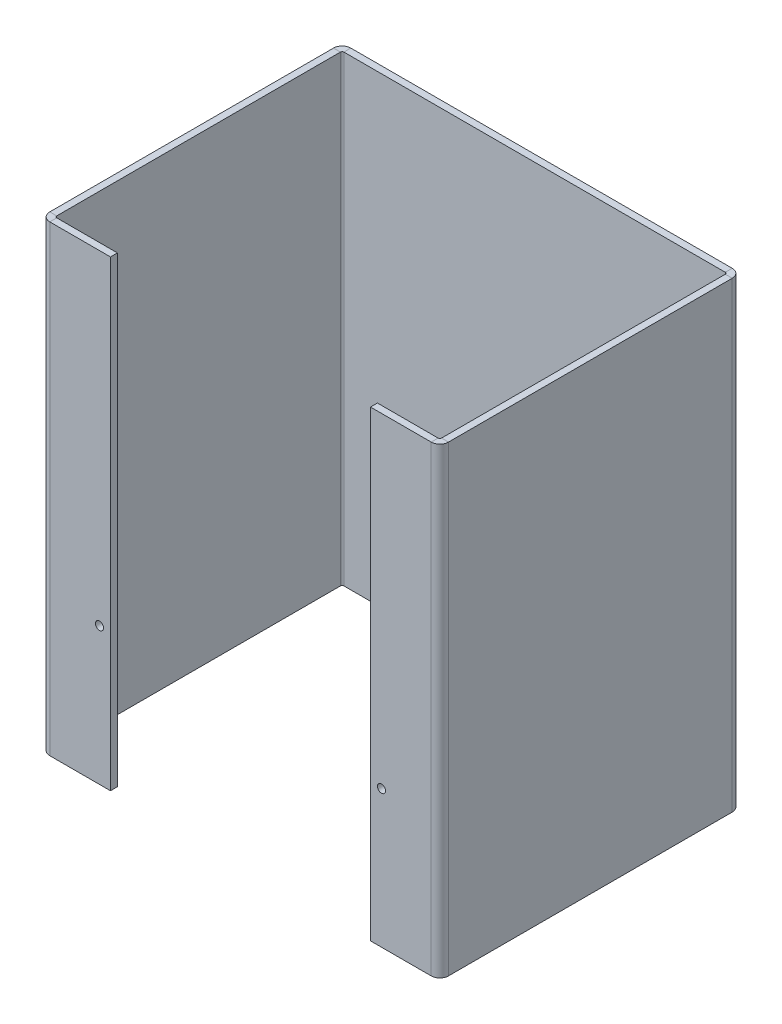
ISO-10303-21;
HEADER;
FILE_DESCRIPTION(('STEP AP214'),'2;1');
FILE_NAME('part.step','',(''),(''),'','','');
FILE_SCHEMA(('AUTOMOTIVE_DESIGN { 1 0 10303 214 1 1 1 1 }'));
ENDSEC;
DATA;
#1=APPLICATION_CONTEXT('core data for automotive mechanical design processes');
#2=APPLICATION_PROTOCOL_DEFINITION('international standard','automotive_design',2000,#1);
#3=PRODUCT_CONTEXT('',#1,'mechanical');
#4=PRODUCT('Part','Part','',(#3));
#5=PRODUCT_RELATED_PRODUCT_CATEGORY('part','',(#4));
#6=PRODUCT_DEFINITION_FORMATION('','',#4);
#7=PRODUCT_DEFINITION_CONTEXT('part definition',#1,'design');
#8=PRODUCT_DEFINITION('design','',#6,#7);
#9=PRODUCT_DEFINITION_SHAPE('','',#8);
#10=(LENGTH_UNIT() NAMED_UNIT(*) SI_UNIT(.MILLI.,.METRE.));
#11=(NAMED_UNIT(*) PLANE_ANGLE_UNIT() SI_UNIT($,.RADIAN.));
#12=(NAMED_UNIT(*) SI_UNIT($,.STERADIAN.) SOLID_ANGLE_UNIT());
#13=UNCERTAINTY_MEASURE_WITH_UNIT(LENGTH_MEASURE(1.E-05),#10,'distance_accuracy_value','');
#14=(GEOMETRIC_REPRESENTATION_CONTEXT(3) GLOBAL_UNCERTAINTY_ASSIGNED_CONTEXT((#13)) GLOBAL_UNIT_ASSIGNED_CONTEXT((#10,
#11,#12)) REPRESENTATION_CONTEXT('',''));
#15=CARTESIAN_POINT('',(0.,0.,0.));
#16=DIRECTION('',(0.,0.,1.));
#17=DIRECTION('',(1.,0.,0.));
#18=AXIS2_PLACEMENT_3D('',#15,#16,#17);
#19=CARTESIAN_POINT('',(86.2366000000003,0.,-85.2766430645095));
#20=DIRECTION('',(-1.,0.,0.));
#21=DIRECTION('',(0.,0.,1.));
#22=AXIS2_PLACEMENT_3D('',#19,#20,#21);
#23=PLANE('',#22);
#24=DIRECTION('',(0.,1.,0.));
#25=VECTOR('',#24,1.);
#26=CARTESIAN_POINT('',(86.2365999999996,100.,123.486756935491));
#27=LINE('',#26,#25);
#28=CARTESIAN_POINT('',(86.2365999999996,100.,123.486756935491));
#29=VERTEX_POINT('',#28);
#30=CARTESIAN_POINT('',(86.2365999999998,-100.,123.486756935491));
#31=VERTEX_POINT('',#30);
#32=EDGE_CURVE('E270',#29,#31,#27,.F.);
#33=ORIENTED_EDGE('',*,*,#32,.T.);
#34=DIRECTION('',(0.,0.,1.));
#35=VECTOR('',#34,1.);
#36=CARTESIAN_POINT('',(86.2366000000001,-100.,-2.77664306450952));
#37=LINE('',#36,#35);
#38=CARTESIAN_POINT('',(86.2366000000001,-100.,0.73660000000007));
#39=VERTEX_POINT('',#38);
#40=EDGE_CURVE('E414',#39,#31,#37,.T.);
#41=ORIENTED_EDGE('',*,*,#40,.F.);
#42=DIRECTION('',(0.,1.,0.));
#43=VECTOR('',#42,1.);
#44=CARTESIAN_POINT('',(86.2366,0.,0.736600000000018));
#45=LINE('',#44,#43);
#46=CARTESIAN_POINT('',(86.2366,100.,0.736600000000018));
#47=VERTEX_POINT('',#46);
#48=EDGE_CURVE('E400',#39,#47,#45,.T.);
#49=ORIENTED_EDGE('',*,*,#48,.T.);
#50=DIRECTION('',(0.,0.,-1.));
#51=VECTOR('',#50,1.);
#52=CARTESIAN_POINT('',(86.2366,100.,-2.77664306450948));
#53=LINE('',#52,#51);
#54=EDGE_CURVE('E404',#29,#47,#53,.T.);
#55=ORIENTED_EDGE('',*,*,#54,.F.);
#56=EDGE_LOOP('',(#33,#41,#49,#55));
#57=FACE_BOUND('',#56,.T.);
#58=ADVANCED_FACE('F86',(#57),#23,.F.);
#59=CARTESIAN_POINT('',(86.2366,100.,-2.77664306450948));
#60=DIRECTION('',(0.,1.,0.));
#61=DIRECTION('',(0.,0.,-1.));
#62=AXIS2_PLACEMENT_3D('',#59,#60,#61);
#63=PLANE('',#62);
#64=DIRECTION('',(0.,0.,-1.));
#65=VECTOR('',#64,1.);
#66=CARTESIAN_POINT('',(83.2366,100.,-2.77664306450949));
#67=LINE('',#66,#65);
#68=CARTESIAN_POINT('',(83.2365999999996,100.,123.486756935491));
#69=VERTEX_POINT('',#68);
#70=CARTESIAN_POINT('',(83.2366,100.,0.736600000000014));
#71=VERTEX_POINT('',#70);
#72=EDGE_CURVE('E415',#69,#71,#67,.T.);
#73=ORIENTED_EDGE('',*,*,#72,.F.);
#74=DIRECTION('',(1.,0.,0.));
#75=VECTOR('',#74,1.);
#76=CARTESIAN_POINT('',(83.2365999999996,100.,123.486756935491));
#77=LINE('',#76,#75);
#78=EDGE_CURVE('E276',#69,#29,#77,.T.);
#79=ORIENTED_EDGE('',*,*,#78,.T.);
#80=ORIENTED_EDGE('',*,*,#54,.T.);
#81=DIRECTION('',(1.,0.,0.));
#82=VECTOR('',#81,1.);
#83=CARTESIAN_POINT('',(86.2366,100.,0.736600000000018));
#84=LINE('',#83,#82);
#85=EDGE_CURVE('E409',#71,#47,#84,.T.);
#86=ORIENTED_EDGE('',*,*,#85,.F.);
#87=EDGE_LOOP('',(#73,#79,#80,#86));
#88=FACE_BOUND('',#87,.T.);
#89=ADVANCED_FACE('F468',(#88),#63,.T.);
#90=CARTESIAN_POINT('',(83.2366000000003,0.,-85.2766430645095));
#91=DIRECTION('',(-1.,0.,0.));
#92=DIRECTION('',(0.,0.,1.));
#93=AXIS2_PLACEMENT_3D('',#90,#91,#92);
#94=PLANE('',#93);
#95=DIRECTION('',(0.,0.,1.));
#96=VECTOR('',#95,1.);
#97=CARTESIAN_POINT('',(83.2366000000001,-100.,-2.77664306450953));
#98=LINE('',#97,#96);
#99=CARTESIAN_POINT('',(83.2366000000001,-100.,0.736600000000014));
#100=VERTEX_POINT('',#99);
#101=CARTESIAN_POINT('',(83.2365999999996,-100.,123.486756935491));
#102=VERTEX_POINT('',#101);
#103=EDGE_CURVE('E417',#100,#102,#98,.T.);
#104=ORIENTED_EDGE('',*,*,#103,.T.);
#105=DIRECTION('',(0.,1.,0.));
#106=VECTOR('',#105,1.);
#107=CARTESIAN_POINT('',(83.2365999999996,100.,123.486756935491));
#108=LINE('',#107,#106);
#109=EDGE_CURVE('E103',#69,#102,#108,.F.);
#110=ORIENTED_EDGE('',*,*,#109,.F.);
#111=ORIENTED_EDGE('',*,*,#72,.T.);
#112=DIRECTION('',(0.,1.,0.));
#113=VECTOR('',#112,1.);
#114=CARTESIAN_POINT('',(83.2366,0.,0.736600000000004));
#115=LINE('',#114,#113);
#116=EDGE_CURVE('E406',#100,#71,#115,.T.);
#117=ORIENTED_EDGE('',*,*,#116,.F.);
#118=EDGE_LOOP('',(#104,#110,#111,#117));
#119=FACE_BOUND('',#118,.T.);
#120=ADVANCED_FACE('F466',(#119),#94,.T.);
#121=CARTESIAN_POINT('',(-86.2366000000003,0.,-85.2766430645095));
#122=DIRECTION('',(1.,0.,0.));
#123=DIRECTION('',(0.,0.,-1.));
#124=AXIS2_PLACEMENT_3D('',#121,#122,#123);
#125=PLANE('',#124);
#126=DIRECTION('',(0.,-1.,0.));
#127=VECTOR('',#126,1.);
#128=CARTESIAN_POINT('',(-86.2365999999996,-100.,123.48675693549));
#129=LINE('',#128,#127);
#130=CARTESIAN_POINT('',(-86.2365999999996,-100.,123.48675693549));
#131=VERTEX_POINT('',#130);
#132=CARTESIAN_POINT('',(-86.2365999999998,100.,123.486756935491));
#133=VERTEX_POINT('',#132);
#134=EDGE_CURVE('E322',#131,#133,#129,.F.);
#135=ORIENTED_EDGE('',*,*,#134,.T.);
#136=DIRECTION('',(0.,0.,1.));
#137=VECTOR('',#136,1.);
#138=CARTESIAN_POINT('',(-86.2366000000006,100.,-167.776643064509));
#139=LINE('',#138,#137);
#140=CARTESIAN_POINT('',(-86.2366,100.,0.736600000000023));
#141=VERTEX_POINT('',#140);
#142=EDGE_CURVE('E344',#141,#133,#139,.T.);
#143=ORIENTED_EDGE('',*,*,#142,.F.);
#144=DIRECTION('',(0.,1.,0.));
#145=VECTOR('',#144,1.);
#146=CARTESIAN_POINT('',(-86.2366,0.,0.736600000000032));
#147=LINE('',#146,#145);
#148=CARTESIAN_POINT('',(-86.2366,-100.,0.736600000000046));
#149=VERTEX_POINT('',#148);
#150=EDGE_CURVE('E341',#149,#141,#147,.T.);
#151=ORIENTED_EDGE('',*,*,#150,.F.);
#152=DIRECTION('',(0.,0.,-1.));
#153=VECTOR('',#152,1.);
#154=CARTESIAN_POINT('',(-86.2366000000006,-100.,-167.776643064509));
#155=LINE('',#154,#153);
#156=EDGE_CURVE('E359',#131,#149,#155,.T.);
#157=ORIENTED_EDGE('',*,*,#156,.F.);
#158=EDGE_LOOP('',(#135,#143,#151,#157));
#159=FACE_BOUND('',#158,.T.);
#160=ADVANCED_FACE('F521',(#159),#125,.F.);
#161=CARTESIAN_POINT('',(-86.2366000000006,-100.,-167.776643064509));
#162=DIRECTION('',(0.,-1.,0.));
#163=DIRECTION('',(0.,0.,-1.));
#164=AXIS2_PLACEMENT_3D('',#161,#162,#163);
#165=PLANE('',#164);
#166=DIRECTION('',(0.,0.,-1.));
#167=VECTOR('',#166,1.);
#168=CARTESIAN_POINT('',(-83.2366000000006,-100.,-167.776643064509));
#169=LINE('',#168,#167);
#170=CARTESIAN_POINT('',(-83.2365999999996,-100.,123.48675693549));
#171=VERTEX_POINT('',#170);
#172=CARTESIAN_POINT('',(-83.2366,-100.,0.736600000000032));
#173=VERTEX_POINT('',#172);
#174=EDGE_CURVE('E354',#171,#173,#169,.T.);
#175=ORIENTED_EDGE('',*,*,#174,.F.);
#176=DIRECTION('',(-1.,0.,0.));
#177=VECTOR('',#176,1.);
#178=CARTESIAN_POINT('',(-83.2365999999996,-100.,123.48675693549));
#179=LINE('',#178,#177);
#180=EDGE_CURVE('E329',#171,#131,#179,.T.);
#181=ORIENTED_EDGE('',*,*,#180,.T.);
#182=ORIENTED_EDGE('',*,*,#156,.T.);
#183=DIRECTION('',(1.,0.,0.));
#184=VECTOR('',#183,1.);
#185=CARTESIAN_POINT('',(-86.2366,-100.,0.736600000000046));
#186=LINE('',#185,#184);
#187=EDGE_CURVE('E356',#149,#173,#186,.T.);
#188=ORIENTED_EDGE('',*,*,#187,.T.);
#189=EDGE_LOOP('',(#175,#181,#182,#188));
#190=FACE_BOUND('',#189,.T.);
#191=ADVANCED_FACE('F558',(#190),#165,.T.);
#192=CARTESIAN_POINT('',(-83.2366000000003,0.,-85.2766430645095));
#193=DIRECTION('',(1.,0.,0.));
#194=DIRECTION('',(0.,0.,-1.));
#195=AXIS2_PLACEMENT_3D('',#192,#193,#194);
#196=PLANE('',#195);
#197=DIRECTION('',(0.,0.,1.));
#198=VECTOR('',#197,1.);
#199=CARTESIAN_POINT('',(-83.2366000000006,100.,-167.776643064509));
#200=LINE('',#199,#198);
#201=CARTESIAN_POINT('',(-83.2366,100.,0.736600000000004));
#202=VERTEX_POINT('',#201);
#203=CARTESIAN_POINT('',(-83.2365999999996,100.,123.48675693549));
#204=VERTEX_POINT('',#203);
#205=EDGE_CURVE('E349',#202,#204,#200,.T.);
#206=ORIENTED_EDGE('',*,*,#205,.T.);
#207=DIRECTION('',(0.,-1.,0.));
#208=VECTOR('',#207,1.);
#209=CARTESIAN_POINT('',(-83.2365999999996,-100.,123.48675693549));
#210=LINE('',#209,#208);
#211=EDGE_CURVE('E111',#171,#204,#210,.F.);
#212=ORIENTED_EDGE('',*,*,#211,.F.);
#213=ORIENTED_EDGE('',*,*,#174,.T.);
#214=DIRECTION('',(0.,1.,0.));
#215=VECTOR('',#214,1.);
#216=CARTESIAN_POINT('',(-83.2366,0.,0.736600000000018));
#217=LINE('',#216,#215);
#218=EDGE_CURVE('E351',#173,#202,#217,.T.);
#219=ORIENTED_EDGE('',*,*,#218,.T.);
#220=EDGE_LOOP('',(#206,#212,#213,#219));
#221=FACE_BOUND('',#220,.T.);
#222=ADVANCED_FACE('F525',(#221),#196,.T.);
#223=CARTESIAN_POINT('',(0.,0.,-3.));
#224=DIRECTION('',(0.,0.,1.));
#225=DIRECTION('',(1.,0.,0.));
#226=AXIS2_PLACEMENT_3D('',#223,#224,#225);
#227=PLANE('',#226);
#228=DIRECTION('',(1.,0.,0.));
#229=VECTOR('',#228,1.);
#230=CARTESIAN_POINT('',(82.5,-100.,-3.));
#231=LINE('',#230,#229);
#232=CARTESIAN_POINT('',(-82.5,-100.,-3.));
#233=VERTEX_POINT('',#232);
#234=CARTESIAN_POINT('',(82.5,-100.,-3.));
#235=VERTEX_POINT('',#234);
#236=EDGE_CURVE('E90',#233,#235,#231,.T.);
#237=ORIENTED_EDGE('',*,*,#236,.F.);
#238=DIRECTION('',(0.,1.,0.));
#239=VECTOR('',#238,1.);
#240=CARTESIAN_POINT('',(-82.5,0.,-3.));
#241=LINE('',#240,#239);
#242=CARTESIAN_POINT('',(-82.5,100.,-3.00000000000001));
#243=VERTEX_POINT('',#242);
#244=EDGE_CURVE('E412',#233,#243,#241,.T.);
#245=ORIENTED_EDGE('',*,*,#244,.T.);
#246=DIRECTION('',(-1.,0.,0.));
#247=VECTOR('',#246,1.);
#248=CARTESIAN_POINT('',(82.5,100.,-3.));
#249=LINE('',#248,#247);
#250=CARTESIAN_POINT('',(82.5000000000001,100.,-3.));
#251=VERTEX_POINT('',#250);
#252=EDGE_CURVE('E390',#251,#243,#249,.T.);
#253=ORIENTED_EDGE('',*,*,#252,.F.);
#254=DIRECTION('',(0.,1.,0.));
#255=VECTOR('',#254,1.);
#256=CARTESIAN_POINT('',(82.5,0.,-3.));
#257=LINE('',#256,#255);
#258=EDGE_CURVE('E382',#235,#251,#257,.T.);
#259=ORIENTED_EDGE('',*,*,#258,.F.);
#260=EDGE_LOOP('',(#237,#245,#253,#259));
#261=FACE_BOUND('',#260,.T.);
#262=ADVANCED_FACE('F450',(#261),#227,.F.);
#263=CARTESIAN_POINT('',(86.2366000000001,-100.,-2.77664306450952));
#264=DIRECTION('',(0.,-1.,0.));
#265=DIRECTION('',(0.,0.,1.));
#266=AXIS2_PLACEMENT_3D('',#263,#264,#265);
#267=PLANE('',#266);
#268=DIRECTION('',(1.,0.,0.));
#269=VECTOR('',#268,1.);
#270=CARTESIAN_POINT('',(83.2365999999996,-100.,123.486756935491));
#271=LINE('',#270,#269);
#272=EDGE_CURVE('E286',#102,#31,#271,.T.);
#273=ORIENTED_EDGE('',*,*,#272,.F.);
#274=ORIENTED_EDGE('',*,*,#103,.F.);
#275=DIRECTION('',(-1.,0.,0.));
#276=VECTOR('',#275,1.);
#277=CARTESIAN_POINT('',(86.2366000000001,-100.,0.736600000000018));
#278=LINE('',#277,#276);
#279=EDGE_CURVE('E403',#39,#100,#278,.T.);
#280=ORIENTED_EDGE('',*,*,#279,.F.);
#281=ORIENTED_EDGE('',*,*,#40,.T.);
#282=EDGE_LOOP('',(#273,#274,#280,#281));
#283=FACE_BOUND('',#282,.T.);
#284=ADVANCED_FACE('F464',(#283),#267,.T.);
#285=CARTESIAN_POINT('',(82.5,-100.,-3.));
#286=DIRECTION('',(0.,-1.,0.));
#287=DIRECTION('',(1.,0.,0.));
#288=AXIS2_PLACEMENT_3D('',#285,#286,#287);
#289=PLANE('',#288);
#290=DIRECTION('',(0.,0.,1.));
#291=VECTOR('',#290,1.);
#292=CARTESIAN_POINT('',(-82.5,-100.,-3.));
#293=LINE('',#292,#291);
#294=CARTESIAN_POINT('',(-82.5,-100.,0.));
#295=VERTEX_POINT('',#294);
#296=EDGE_CURVE('E423',#233,#295,#293,.T.);
#297=ORIENTED_EDGE('',*,*,#296,.F.);
#298=ORIENTED_EDGE('',*,*,#236,.T.);
#299=DIRECTION('',(0.,0.,1.));
#300=VECTOR('',#299,1.);
#301=CARTESIAN_POINT('',(82.5,-100.,-3.));
#302=LINE('',#301,#300);
#303=CARTESIAN_POINT('',(82.5,-100.,0.));
#304=VERTEX_POINT('',#303);
#305=EDGE_CURVE('E396',#235,#304,#302,.T.);
#306=ORIENTED_EDGE('',*,*,#305,.T.);
#307=DIRECTION('',(1.,0.,0.));
#308=VECTOR('',#307,1.);
#309=CARTESIAN_POINT('',(82.5,-100.,0.));
#310=LINE('',#309,#308);
#311=EDGE_CURVE('E395',#295,#304,#310,.T.);
#312=ORIENTED_EDGE('',*,*,#311,.F.);
#313=EDGE_LOOP('',(#297,#298,#306,#312));
#314=FACE_BOUND('',#313,.T.);
#315=ADVANCED_FACE('F446',(#314),#289,.T.);
#316=CARTESIAN_POINT('',(0.,0.,0.));
#317=DIRECTION('',(0.,0.,1.));
#318=DIRECTION('',(1.,0.,0.));
#319=AXIS2_PLACEMENT_3D('',#316,#317,#318);
#320=PLANE('',#319);
#321=DIRECTION('',(0.,1.,0.));
#322=VECTOR('',#321,1.);
#323=CARTESIAN_POINT('',(-82.5,0.,0.));
#324=LINE('',#323,#322);
#325=CARTESIAN_POINT('',(-82.5,100.,0.));
#326=VERTEX_POINT('',#325);
#327=EDGE_CURVE('E95',#295,#326,#324,.T.);
#328=ORIENTED_EDGE('',*,*,#327,.F.);
#329=ORIENTED_EDGE('',*,*,#311,.T.);
#330=DIRECTION('',(0.,1.,0.));
#331=VECTOR('',#330,1.);
#332=CARTESIAN_POINT('',(82.5,0.,0.));
#333=LINE('',#332,#331);
#334=CARTESIAN_POINT('',(82.5,100.,0.));
#335=VERTEX_POINT('',#334);
#336=EDGE_CURVE('E392',#304,#335,#333,.T.);
#337=ORIENTED_EDGE('',*,*,#336,.T.);
#338=DIRECTION('',(-1.,0.,0.));
#339=VECTOR('',#338,1.);
#340=CARTESIAN_POINT('',(82.5,100.,0.));
#341=LINE('',#340,#339);
#342=EDGE_CURVE('E391',#335,#326,#341,.T.);
#343=ORIENTED_EDGE('',*,*,#342,.T.);
#344=EDGE_LOOP('',(#328,#329,#337,#343));
#345=FACE_BOUND('',#344,.T.);
#346=ADVANCED_FACE('F431',(#345),#320,.T.);
#347=CARTESIAN_POINT('',(82.5,100.,-3.));
#348=DIRECTION('',(0.,1.,0.));
#349=DIRECTION('',(-1.,0.,0.));
#350=AXIS2_PLACEMENT_3D('',#347,#348,#349);
#351=PLANE('',#350);
#352=DIRECTION('',(0.,0.,-1.));
#353=VECTOR('',#352,1.);
#354=CARTESIAN_POINT('',(-82.5,100.,-3.));
#355=LINE('',#354,#353);
#356=EDGE_CURVE('E13',#326,#243,#355,.T.);
#357=ORIENTED_EDGE('',*,*,#356,.F.);
#358=ORIENTED_EDGE('',*,*,#342,.F.);
#359=DIRECTION('',(0.,0.,-1.));
#360=VECTOR('',#359,1.);
#361=CARTESIAN_POINT('',(82.5,100.,-3.));
#362=LINE('',#361,#360);
#363=EDGE_CURVE('E387',#335,#251,#362,.T.);
#364=ORIENTED_EDGE('',*,*,#363,.T.);
#365=ORIENTED_EDGE('',*,*,#252,.T.);
#366=EDGE_LOOP('',(#357,#358,#364,#365));
#367=FACE_BOUND('',#366,.T.);
#368=ADVANCED_FACE('F88',(#367),#351,.T.);
#369=CARTESIAN_POINT('',(82.5000000000001,-100.,0.7366));
#370=DIRECTION('',(0.,-1.,0.));
#371=DIRECTION('',(0.,0.,-1.));
#372=AXIS2_PLACEMENT_3D('',#369,#370,#371);
#373=PLANE('',#372);
#374=ORIENTED_EDGE('',*,*,#279,.T.);
#375=CARTESIAN_POINT('',(82.5000000000001,-100.,0.7366));
#376=DIRECTION('',(0.,-1.,0.));
#377=DIRECTION('',(1.,0.,0.));
#378=AXIS2_PLACEMENT_3D('',#375,#376,#377);
#379=CIRCLE('',#378,0.7366);
#380=EDGE_CURVE('E370',#100,#304,#379,.F.);
#381=ORIENTED_EDGE('',*,*,#380,.T.);
#382=ORIENTED_EDGE('',*,*,#305,.F.);
#383=CARTESIAN_POINT('',(82.5000000000001,-100.,0.7366));
#384=DIRECTION('',(0.,1.,0.));
#385=DIRECTION('',(0.,0.,-1.));
#386=AXIS2_PLACEMENT_3D('',#383,#384,#385);
#387=CIRCLE('',#386,3.7366);
#388=EDGE_CURVE('E375',#39,#235,#387,.T.);
#389=ORIENTED_EDGE('',*,*,#388,.F.);
#390=EDGE_LOOP('',(#374,#381,#382,#389));
#391=FACE_BOUND('',#390,.T.);
#392=ADVANCED_FACE('F438',(#391),#373,.T.);
#393=CARTESIAN_POINT('',(82.5,100.,0.7366));
#394=DIRECTION('',(0.,1.,0.));
#395=DIRECTION('',(0.,0.,1.));
#396=AXIS2_PLACEMENT_3D('',#393,#394,#395);
#397=PLANE('',#396);
#398=CARTESIAN_POINT('',(82.5,100.,0.7366));
#399=DIRECTION('',(0.,-1.,0.));
#400=DIRECTION('',(1.,0.,0.));
#401=AXIS2_PLACEMENT_3D('',#398,#399,#400);
#402=CIRCLE('',#401,0.7366);
#403=EDGE_CURVE('E379',#335,#71,#402,.T.);
#404=ORIENTED_EDGE('',*,*,#403,.T.);
#405=ORIENTED_EDGE('',*,*,#85,.T.);
#406=CARTESIAN_POINT('',(82.5,100.,0.7366));
#407=DIRECTION('',(0.,-1.,0.));
#408=DIRECTION('',(0.,0.,1.));
#409=AXIS2_PLACEMENT_3D('',#406,#407,#408);
#410=CIRCLE('',#409,3.73660000000001);
#411=EDGE_CURVE('E378',#251,#47,#410,.T.);
#412=ORIENTED_EDGE('',*,*,#411,.F.);
#413=ORIENTED_EDGE('',*,*,#363,.F.);
#414=EDGE_LOOP('',(#404,#405,#412,#413));
#415=FACE_BOUND('',#414,.T.);
#416=ADVANCED_FACE('F457',(#415),#397,.T.);
#417=CARTESIAN_POINT('',(82.5,200.053350076499,0.7366));
#418=DIRECTION('',(0.,-1.,0.));
#419=DIRECTION('',(1.,0.,0.));
#420=AXIS2_PLACEMENT_3D('',#417,#418,#419);
#421=CYLINDRICAL_SURFACE('',#420,3.7366);
#422=ORIENTED_EDGE('',*,*,#258,.T.);
#423=ORIENTED_EDGE('',*,*,#411,.T.);
#424=ORIENTED_EDGE('',*,*,#48,.F.);
#425=ORIENTED_EDGE('',*,*,#388,.T.);
#426=EDGE_LOOP('',(#422,#423,#424,#425));
#427=FACE_BOUND('',#426,.T.);
#428=ADVANCED_FACE('F455',(#427),#421,.T.);
#429=CARTESIAN_POINT('',(82.5,200.053350076499,0.7366));
#430=DIRECTION('',(0.,-1.,0.));
#431=DIRECTION('',(1.,0.,0.));
#432=AXIS2_PLACEMENT_3D('',#429,#430,#431);
#433=CYLINDRICAL_SURFACE('',#432,0.7366);
#434=ORIENTED_EDGE('',*,*,#336,.F.);
#435=ORIENTED_EDGE('',*,*,#380,.F.);
#436=ORIENTED_EDGE('',*,*,#116,.T.);
#437=ORIENTED_EDGE('',*,*,#403,.F.);
#438=EDGE_LOOP('',(#434,#435,#436,#437));
#439=FACE_BOUND('',#438,.T.);
#440=ADVANCED_FACE('F444',(#439),#433,.F.);
#441=CARTESIAN_POINT('',(-82.5,-100.,0.7366));
#442=DIRECTION('',(0.,-1.,0.));
#443=DIRECTION('',(0.,0.,-1.));
#444=AXIS2_PLACEMENT_3D('',#441,#442,#443);
#445=PLANE('',#444);
#446=ORIENTED_EDGE('',*,*,#296,.T.);
#447=CARTESIAN_POINT('',(-82.5,-100.,0.7366));
#448=DIRECTION('',(0.,1.,0.));
#449=DIRECTION('',(-1.,0.,0.));
#450=AXIS2_PLACEMENT_3D('',#447,#448,#449);
#451=CIRCLE('',#450,0.7366);
#452=EDGE_CURVE('E346',#295,#173,#451,.T.);
#453=ORIENTED_EDGE('',*,*,#452,.T.);
#454=ORIENTED_EDGE('',*,*,#187,.F.);
#455=CARTESIAN_POINT('',(-82.5,-100.,0.7366));
#456=DIRECTION('',(0.,1.,0.));
#457=DIRECTION('',(0.,0.,-1.));
#458=AXIS2_PLACEMENT_3D('',#455,#456,#457);
#459=CIRCLE('',#458,3.7366);
#460=EDGE_CURVE('E363',#233,#149,#459,.T.);
#461=ORIENTED_EDGE('',*,*,#460,.F.);
#462=EDGE_LOOP('',(#446,#453,#454,#461));
#463=FACE_BOUND('',#462,.T.);
#464=ADVANCED_FACE('F547',(#463),#445,.T.);
#465=CARTESIAN_POINT('',(-82.5,100.,0.7366));
#466=DIRECTION('',(0.,1.,0.));
#467=DIRECTION('',(0.,0.,1.));
#468=AXIS2_PLACEMENT_3D('',#465,#466,#467);
#469=PLANE('',#468);
#470=DIRECTION('',(-1.,0.,0.));
#471=VECTOR('',#470,1.);
#472=CARTESIAN_POINT('',(-86.2366,100.,0.736600000000018));
#473=LINE('',#472,#471);
#474=EDGE_CURVE('E347',#202,#141,#473,.T.);
#475=ORIENTED_EDGE('',*,*,#474,.F.);
#476=CARTESIAN_POINT('',(-82.5,100.,0.7366));
#477=DIRECTION('',(0.,1.,0.));
#478=DIRECTION('',(-1.,0.,0.));
#479=AXIS2_PLACEMENT_3D('',#476,#477,#478);
#480=CIRCLE('',#479,0.7366);
#481=EDGE_CURVE('E367',#202,#326,#480,.F.);
#482=ORIENTED_EDGE('',*,*,#481,.T.);
#483=ORIENTED_EDGE('',*,*,#356,.T.);
#484=CARTESIAN_POINT('',(-82.5,100.,0.7366));
#485=DIRECTION('',(0.,-1.,0.));
#486=DIRECTION('',(0.,0.,1.));
#487=AXIS2_PLACEMENT_3D('',#484,#485,#486);
#488=CIRCLE('',#487,3.73660000000001);
#489=EDGE_CURVE('E366',#141,#243,#488,.T.);
#490=ORIENTED_EDGE('',*,*,#489,.F.);
#491=EDGE_LOOP('',(#475,#482,#483,#490));
#492=FACE_BOUND('',#491,.T.);
#493=ADVANCED_FACE('F540',(#492),#469,.T.);
#494=CARTESIAN_POINT('',(-82.5,-200.053350076499,0.7366));
#495=DIRECTION('',(0.,1.,0.));
#496=DIRECTION('',(-1.,0.,0.));
#497=AXIS2_PLACEMENT_3D('',#494,#495,#496);
#498=CYLINDRICAL_SURFACE('',#497,3.7366);
#499=ORIENTED_EDGE('',*,*,#489,.T.);
#500=ORIENTED_EDGE('',*,*,#244,.F.);
#501=ORIENTED_EDGE('',*,*,#460,.T.);
#502=ORIENTED_EDGE('',*,*,#150,.T.);
#503=EDGE_LOOP('',(#499,#500,#501,#502));
#504=FACE_BOUND('',#503,.T.);
#505=ADVANCED_FACE('F549',(#504),#498,.T.);
#506=CARTESIAN_POINT('',(-82.5,-200.053350076499,0.7366));
#507=DIRECTION('',(0.,1.,0.));
#508=DIRECTION('',(-1.,0.,0.));
#509=AXIS2_PLACEMENT_3D('',#506,#507,#508);
#510=CYLINDRICAL_SURFACE('',#509,0.7366);
#511=ORIENTED_EDGE('',*,*,#481,.F.);
#512=ORIENTED_EDGE('',*,*,#218,.F.);
#513=ORIENTED_EDGE('',*,*,#452,.F.);
#514=ORIENTED_EDGE('',*,*,#327,.T.);
#515=EDGE_LOOP('',(#511,#512,#513,#514));
#516=FACE_BOUND('',#515,.T.);
#517=ADVANCED_FACE('F544',(#516),#510,.F.);
#518=CARTESIAN_POINT('',(-86.2366000000006,100.,-167.776643064509));
#519=DIRECTION('',(0.,1.,0.));
#520=DIRECTION('',(0.,0.,1.));
#521=AXIS2_PLACEMENT_3D('',#518,#519,#520);
#522=PLANE('',#521);
#523=DIRECTION('',(-1.,0.,0.));
#524=VECTOR('',#523,1.);
#525=CARTESIAN_POINT('',(-83.2365999999996,100.,123.48675693549));
#526=LINE('',#525,#524);
#527=EDGE_CURVE('E338',#204,#133,#526,.T.);
#528=ORIENTED_EDGE('',*,*,#527,.F.);
#529=ORIENTED_EDGE('',*,*,#205,.F.);
#530=ORIENTED_EDGE('',*,*,#474,.T.);
#531=ORIENTED_EDGE('',*,*,#142,.T.);
#532=EDGE_LOOP('',(#528,#529,#530,#531));
#533=FACE_BOUND('',#532,.T.);
#534=ADVANCED_FACE('F555',(#533),#522,.T.);
#535=CARTESIAN_POINT('',(-82.4999999999996,100.,123.486756935491));
#536=DIRECTION('',(0.,1.,0.));
#537=DIRECTION('',(0.,0.,1.));
#538=AXIS2_PLACEMENT_3D('',#535,#536,#537);
#539=PLANE('',#538);
#540=DIRECTION('',(0.,0.,-1.));
#541=VECTOR('',#540,1.);
#542=CARTESIAN_POINT('',(-82.4999999999996,100.,127.223356935491));
#543=LINE('',#542,#541);
#544=CARTESIAN_POINT('',(-82.4999999999996,100.,124.223356935491));
#545=VERTEX_POINT('',#544);
#546=CARTESIAN_POINT('',(-82.4999999999996,100.,127.223356935491));
#547=VERTEX_POINT('',#546);
#548=EDGE_CURVE('E289',#545,#547,#543,.F.);
#549=ORIENTED_EDGE('',*,*,#548,.F.);
#550=CARTESIAN_POINT('',(-82.4999999999996,100.,123.486756935491));
#551=DIRECTION('',(0.,-1.,0.));
#552=DIRECTION('',(0.,0.,-1.));
#553=AXIS2_PLACEMENT_3D('',#550,#551,#552);
#554=CIRCLE('',#553,0.736600000000018);
#555=EDGE_CURVE('E332',#204,#545,#554,.F.);
#556=ORIENTED_EDGE('',*,*,#555,.F.);
#557=ORIENTED_EDGE('',*,*,#527,.T.);
#558=CARTESIAN_POINT('',(-82.4999999999996,100.,123.486756935491));
#559=DIRECTION('',(0.,-1.,0.));
#560=DIRECTION('',(0.,0.,-1.));
#561=AXIS2_PLACEMENT_3D('',#558,#559,#560);
#562=CIRCLE('',#561,3.73660000000002);
#563=EDGE_CURVE('E325',#133,#547,#562,.F.);
#564=ORIENTED_EDGE('',*,*,#563,.T.);
#565=EDGE_LOOP('',(#549,#556,#557,#564));
#566=FACE_BOUND('',#565,.T.);
#567=ADVANCED_FACE('F585',(#566),#539,.T.);
#568=CARTESIAN_POINT('',(-82.4999999999996,-100.,123.486756935491));
#569=DIRECTION('',(0.,1.,0.));
#570=DIRECTION('',(0.,0.,1.));
#571=AXIS2_PLACEMENT_3D('',#568,#569,#570);
#572=PLANE('',#571);
#573=CARTESIAN_POINT('',(-82.4999999999996,-100.,123.486756935491));
#574=DIRECTION('',(0.,-1.,0.));
#575=DIRECTION('',(0.,0.,-1.));
#576=AXIS2_PLACEMENT_3D('',#573,#574,#575);
#577=CIRCLE('',#576,0.736600000000018);
#578=CARTESIAN_POINT('',(-82.4999999999996,-100.,124.223356935491));
#579=VERTEX_POINT('',#578);
#580=EDGE_CURVE('E295',#579,#171,#577,.T.);
#581=ORIENTED_EDGE('',*,*,#580,.F.);
#582=DIRECTION('',(0.,0.,-1.));
#583=VECTOR('',#582,1.);
#584=CARTESIAN_POINT('',(-82.4999999999996,-100.,124.223356935491));
#585=LINE('',#584,#583);
#586=CARTESIAN_POINT('',(-82.4999999999996,-100.,127.223356935491));
#587=VERTEX_POINT('',#586);
#588=EDGE_CURVE('E315',#579,#587,#585,.F.);
#589=ORIENTED_EDGE('',*,*,#588,.T.);
#590=CARTESIAN_POINT('',(-82.4999999999996,-100.,123.486756935491));
#591=DIRECTION('',(0.,-1.,0.));
#592=DIRECTION('',(0.,0.,-1.));
#593=AXIS2_PLACEMENT_3D('',#590,#591,#592);
#594=CIRCLE('',#593,3.73660000000002);
#595=EDGE_CURVE('E326',#587,#131,#594,.T.);
#596=ORIENTED_EDGE('',*,*,#595,.T.);
#597=ORIENTED_EDGE('',*,*,#180,.F.);
#598=EDGE_LOOP('',(#581,#589,#596,#597));
#599=FACE_BOUND('',#598,.T.);
#600=ADVANCED_FACE('F564',(#599),#572,.F.);
#601=CARTESIAN_POINT('',(-82.4999999999996,-100.,123.486756935491));
#602=DIRECTION('',(0.,-1.,0.));
#603=DIRECTION('',(0.,0.,1.));
#604=AXIS2_PLACEMENT_3D('',#601,#602,#603);
#605=CYLINDRICAL_SURFACE('',#604,3.73660000000002);
#606=ORIENTED_EDGE('',*,*,#134,.F.);
#607=ORIENTED_EDGE('',*,*,#595,.F.);
#608=DIRECTION('',(0.,-1.,0.));
#609=VECTOR('',#608,1.);
#610=CARTESIAN_POINT('',(-82.4999999999996,100.,127.223356935491));
#611=LINE('',#610,#609);
#612=EDGE_CURVE('E313',#587,#547,#611,.F.);
#613=ORIENTED_EDGE('',*,*,#612,.T.);
#614=ORIENTED_EDGE('',*,*,#563,.F.);
#615=EDGE_LOOP('',(#606,#607,#613,#614));
#616=FACE_BOUND('',#615,.T.);
#617=ADVANCED_FACE('F563',(#616),#605,.T.);
#618=CARTESIAN_POINT('',(-82.4999999999996,-100.,123.486756935491));
#619=DIRECTION('',(0.,-1.,0.));
#620=DIRECTION('',(0.,0.,1.));
#621=AXIS2_PLACEMENT_3D('',#618,#619,#620);
#622=CYLINDRICAL_SURFACE('',#621,0.736600000000018);
#623=ORIENTED_EDGE('',*,*,#211,.T.);
#624=ORIENTED_EDGE('',*,*,#555,.T.);
#625=DIRECTION('',(0.,-1.,0.));
#626=VECTOR('',#625,1.);
#627=CARTESIAN_POINT('',(-82.4999999999996,100.,124.223356935491));
#628=LINE('',#627,#626);
#629=EDGE_CURVE('E318',#545,#579,#628,.T.);
#630=ORIENTED_EDGE('',*,*,#629,.T.);
#631=ORIENTED_EDGE('',*,*,#580,.T.);
#632=EDGE_LOOP('',(#623,#624,#630,#631));
#633=FACE_BOUND('',#632,.T.);
#634=ADVANCED_FACE('F588',(#633),#622,.F.);
#635=CARTESIAN_POINT('',(-56.2365999999995,-100.,127.223356935491));
#636=DIRECTION('',(0.,1.,0.));
#637=DIRECTION('',(-1.,0.,0.));
#638=AXIS2_PLACEMENT_3D('',#635,#636,#637);
#639=PLANE('',#638);
#640=ORIENTED_EDGE('',*,*,#588,.F.);
#641=DIRECTION('',(-1.,0.,0.));
#642=VECTOR('',#641,1.);
#643=CARTESIAN_POINT('',(-56.2365999999995,-100.,124.223356935491));
#644=LINE('',#643,#642);
#645=CARTESIAN_POINT('',(-56.2365999999995,-100.,124.223356935491));
#646=VERTEX_POINT('',#645);
#647=EDGE_CURVE('E311',#579,#646,#644,.F.);
#648=ORIENTED_EDGE('',*,*,#647,.T.);
#649=DIRECTION('',(0.,0.,-1.));
#650=VECTOR('',#649,1.);
#651=CARTESIAN_POINT('',(-56.2365999999995,-100.,127.223356935491));
#652=LINE('',#651,#650);
#653=CARTESIAN_POINT('',(-56.2365999999995,-100.,127.223356935491));
#654=VERTEX_POINT('',#653);
#655=EDGE_CURVE('E292',#654,#646,#652,.T.);
#656=ORIENTED_EDGE('',*,*,#655,.F.);
#657=DIRECTION('',(1.,0.,0.));
#658=VECTOR('',#657,1.);
#659=CARTESIAN_POINT('',(0.,-100.,127.223356935491));
#660=LINE('',#659,#658);
#661=EDGE_CURVE('E304',#587,#654,#660,.T.);
#662=ORIENTED_EDGE('',*,*,#661,.F.);
#663=EDGE_LOOP('',(#640,#648,#656,#662));
#664=FACE_BOUND('',#663,.T.);
#665=ADVANCED_FACE('F574',(#664),#639,.F.);
#666=CARTESIAN_POINT('',(-83.2365999999996,100.,127.223356935491));
#667=DIRECTION('',(0.,-1.,0.));
#668=DIRECTION('',(1.,0.,0.));
#669=AXIS2_PLACEMENT_3D('',#666,#667,#668);
#670=PLANE('',#669);
#671=ORIENTED_EDGE('',*,*,#548,.T.);
#672=DIRECTION('',(-1.,0.,0.));
#673=VECTOR('',#672,1.);
#674=CARTESIAN_POINT('',(0.,99.9999999999999,127.223356935491));
#675=LINE('',#674,#673);
#676=CARTESIAN_POINT('',(-56.2365999999996,100.,127.223356935491));
#677=VERTEX_POINT('',#676);
#678=EDGE_CURVE('E299',#677,#547,#675,.T.);
#679=ORIENTED_EDGE('',*,*,#678,.F.);
#680=DIRECTION('',(0.,0.,-1.));
#681=VECTOR('',#680,1.);
#682=CARTESIAN_POINT('',(-56.2365999999996,100.,127.223356935491));
#683=LINE('',#682,#681);
#684=CARTESIAN_POINT('',(-56.2365999999996,100.,124.223356935491));
#685=VERTEX_POINT('',#684);
#686=EDGE_CURVE('E296',#677,#685,#683,.T.);
#687=ORIENTED_EDGE('',*,*,#686,.T.);
#688=DIRECTION('',(1.,0.,0.));
#689=VECTOR('',#688,1.);
#690=CARTESIAN_POINT('',(-83.2365999999996,100.,124.223356935491));
#691=LINE('',#690,#689);
#692=EDGE_CURVE('E306',#685,#545,#691,.F.);
#693=ORIENTED_EDGE('',*,*,#692,.T.);
#694=EDGE_LOOP('',(#671,#679,#687,#693));
#695=FACE_BOUND('',#694,.T.);
#696=ADVANCED_FACE('F582',(#695),#670,.F.);
#697=CARTESIAN_POINT('',(0.,0.,127.223356935491));
#698=DIRECTION('',(0.,0.,-1.));
#699=DIRECTION('',(0.,1.,0.));
#700=AXIS2_PLACEMENT_3D('',#697,#698,#699);
#701=PLANE('',#700);
#702=CARTESIAN_POINT('',(-60.9865999999996,-40.5500000000001,127.223356935491));
#703=DIRECTION('',(0.,0.,-1.));
#704=DIRECTION('',(0.,1.,0.));
#705=AXIS2_PLACEMENT_3D('',#702,#703,#704);
#706=CIRCLE('',#705,1.75);
#707=CARTESIAN_POINT('',(-60.9865999999996,-38.8000000000001,127.223356935491));
#708=VERTEX_POINT('',#707);
#709=EDGE_CURVE('E269',#708,#708,#706,.T.);
#710=ORIENTED_EDGE('',*,*,#709,.T.);
#711=EDGE_LOOP('',(#710));
#712=FACE_BOUND('',#711,.T.);
#713=ORIENTED_EDGE('',*,*,#612,.F.);
#714=ORIENTED_EDGE('',*,*,#661,.T.);
#715=DIRECTION('',(0.,1.,0.));
#716=VECTOR('',#715,1.);
#717=CARTESIAN_POINT('',(-56.2365999999996,0.,127.223356935491));
#718=LINE('',#717,#716);
#719=EDGE_CURVE('E302',#654,#677,#718,.T.);
#720=ORIENTED_EDGE('',*,*,#719,.T.);
#721=ORIENTED_EDGE('',*,*,#678,.T.);
#722=EDGE_LOOP('',(#713,#714,#720,#721));
#723=FACE_BOUND('',#722,.T.);
#724=ADVANCED_FACE('F571',(#712,#723),#701,.F.);
#725=CARTESIAN_POINT('',(0.,0.,124.223356935491));
#726=DIRECTION('',(0.,0.,-1.));
#727=DIRECTION('',(0.,1.,0.));
#728=AXIS2_PLACEMENT_3D('',#725,#726,#727);
#729=PLANE('',#728);
#730=CARTESIAN_POINT('',(-60.9865999999996,-40.5500000000001,124.22335693549));
#731=DIRECTION('',(0.,0.,-1.));
#732=DIRECTION('',(0.,-1.,0.));
#733=AXIS2_PLACEMENT_3D('',#730,#731,#732);
#734=CIRCLE('',#733,1.75);
#735=CARTESIAN_POINT('',(-60.9865999999996,-42.3000000000001,124.22335693549));
#736=VERTEX_POINT('',#735);
#737=EDGE_CURVE('E489',#736,#736,#734,.T.);
#738=ORIENTED_EDGE('',*,*,#737,.F.);
#739=EDGE_LOOP('',(#738));
#740=FACE_BOUND('',#739,.T.);
#741=ORIENTED_EDGE('',*,*,#647,.F.);
#742=ORIENTED_EDGE('',*,*,#629,.F.);
#743=ORIENTED_EDGE('',*,*,#692,.F.);
#744=DIRECTION('',(0.,-1.,0.));
#745=VECTOR('',#744,1.);
#746=CARTESIAN_POINT('',(-56.2365999999996,100.,124.223356935491));
#747=LINE('',#746,#745);
#748=EDGE_CURVE('E309',#646,#685,#747,.F.);
#749=ORIENTED_EDGE('',*,*,#748,.F.);
#750=EDGE_LOOP('',(#741,#742,#743,#749));
#751=FACE_BOUND('',#750,.T.);
#752=ADVANCED_FACE('F590',(#740,#751),#729,.T.);
#753=CARTESIAN_POINT('',(-56.2365999999996,100.,127.223356935491));
#754=DIRECTION('',(-1.,0.,0.));
#755=DIRECTION('',(0.,-1.,0.));
#756=AXIS2_PLACEMENT_3D('',#753,#754,#755);
#757=PLANE('',#756);
#758=ORIENTED_EDGE('',*,*,#748,.T.);
#759=ORIENTED_EDGE('',*,*,#686,.F.);
#760=ORIENTED_EDGE('',*,*,#719,.F.);
#761=ORIENTED_EDGE('',*,*,#655,.T.);
#762=EDGE_LOOP('',(#758,#759,#760,#761));
#763=FACE_BOUND('',#762,.T.);
#764=ADVANCED_FACE('F579',(#763),#757,.F.);
#765=CARTESIAN_POINT('',(82.4999999999996,-100.,123.48675693549));
#766=DIRECTION('',(0.,-1.,0.));
#767=DIRECTION('',(0.,0.,-1.));
#768=AXIS2_PLACEMENT_3D('',#765,#766,#767);
#769=PLANE('',#768);
#770=DIRECTION('',(0.,0.,-1.));
#771=VECTOR('',#770,1.);
#772=CARTESIAN_POINT('',(82.4999999999996,-100.,127.22335693549));
#773=LINE('',#772,#771);
#774=CARTESIAN_POINT('',(82.4999999999996,-100.,124.22335693549));
#775=VERTEX_POINT('',#774);
#776=CARTESIAN_POINT('',(82.4999999999996,-100.,127.22335693549));
#777=VERTEX_POINT('',#776);
#778=EDGE_CURVE('E251',#775,#777,#773,.F.);
#779=ORIENTED_EDGE('',*,*,#778,.F.);
#780=CARTESIAN_POINT('',(82.4999999999996,-100.,123.48675693549));
#781=DIRECTION('',(0.,1.,0.));
#782=DIRECTION('',(0.,0.,1.));
#783=AXIS2_PLACEMENT_3D('',#780,#781,#782);
#784=CIRCLE('',#783,0.736599999999948);
#785=EDGE_CURVE('E279',#102,#775,#784,.F.);
#786=ORIENTED_EDGE('',*,*,#785,.F.);
#787=ORIENTED_EDGE('',*,*,#272,.T.);
#788=CARTESIAN_POINT('',(82.4999999999996,-100.,123.48675693549));
#789=DIRECTION('',(0.,1.,0.));
#790=DIRECTION('',(0.,0.,1.));
#791=AXIS2_PLACEMENT_3D('',#788,#789,#790);
#792=CIRCLE('',#791,3.73659999999995);
#793=EDGE_CURVE('E272',#31,#777,#792,.F.);
#794=ORIENTED_EDGE('',*,*,#793,.T.);
#795=EDGE_LOOP('',(#779,#786,#787,#794));
#796=FACE_BOUND('',#795,.T.);
#797=ADVANCED_FACE('F598',(#796),#769,.T.);
#798=CARTESIAN_POINT('',(82.4999999999996,100.,123.48675693549));
#799=DIRECTION('',(0.,-1.,0.));
#800=DIRECTION('',(0.,0.,-1.));
#801=AXIS2_PLACEMENT_3D('',#798,#799,#800);
#802=PLANE('',#801);
#803=CARTESIAN_POINT('',(82.4999999999996,100.,123.48675693549));
#804=DIRECTION('',(0.,1.,0.));
#805=DIRECTION('',(0.,0.,1.));
#806=AXIS2_PLACEMENT_3D('',#803,#804,#805);
#807=CIRCLE('',#806,0.736599999999948);
#808=CARTESIAN_POINT('',(82.4999999999996,100.,124.22335693549));
#809=VERTEX_POINT('',#808);
#810=EDGE_CURVE('E283',#809,#69,#807,.T.);
#811=ORIENTED_EDGE('',*,*,#810,.F.);
#812=DIRECTION('',(0.,0.,-1.));
#813=VECTOR('',#812,1.);
#814=CARTESIAN_POINT('',(82.4999999999996,100.,124.223356935491));
#815=LINE('',#814,#813);
#816=CARTESIAN_POINT('',(82.4999999999996,100.,127.223356935491));
#817=VERTEX_POINT('',#816);
#818=EDGE_CURVE('E263',#809,#817,#815,.F.);
#819=ORIENTED_EDGE('',*,*,#818,.T.);
#820=CARTESIAN_POINT('',(82.4999999999996,100.,123.48675693549));
#821=DIRECTION('',(0.,1.,0.));
#822=DIRECTION('',(0.,0.,1.));
#823=AXIS2_PLACEMENT_3D('',#820,#821,#822);
#824=CIRCLE('',#823,3.73659999999995);
#825=EDGE_CURVE('E273',#817,#29,#824,.T.);
#826=ORIENTED_EDGE('',*,*,#825,.T.);
#827=ORIENTED_EDGE('',*,*,#78,.F.);
#828=EDGE_LOOP('',(#811,#819,#826,#827));
#829=FACE_BOUND('',#828,.T.);
#830=ADVANCED_FACE('F471',(#829),#802,.F.);
#831=CARTESIAN_POINT('',(82.4999999999996,100.,123.48675693549));
#832=DIRECTION('',(0.,1.,0.));
#833=DIRECTION('',(0.,0.,1.));
#834=AXIS2_PLACEMENT_3D('',#831,#832,#833);
#835=CYLINDRICAL_SURFACE('',#834,3.73659999999995);
#836=ORIENTED_EDGE('',*,*,#32,.F.);
#837=ORIENTED_EDGE('',*,*,#825,.F.);
#838=DIRECTION('',(0.,1.,0.));
#839=VECTOR('',#838,1.);
#840=CARTESIAN_POINT('',(82.4999999999996,-100.,127.22335693549));
#841=LINE('',#840,#839);
#842=EDGE_CURVE('E261',#817,#777,#841,.F.);
#843=ORIENTED_EDGE('',*,*,#842,.T.);
#844=ORIENTED_EDGE('',*,*,#793,.F.);
#845=EDGE_LOOP('',(#836,#837,#843,#844));
#846=FACE_BOUND('',#845,.T.);
#847=ADVANCED_FACE('F719',(#846),#835,.T.);
#848=CARTESIAN_POINT('',(82.4999999999996,100.,123.48675693549));
#849=DIRECTION('',(0.,1.,0.));
#850=DIRECTION('',(0.,0.,1.));
#851=AXIS2_PLACEMENT_3D('',#848,#849,#850);
#852=CYLINDRICAL_SURFACE('',#851,0.736599999999948);
#853=ORIENTED_EDGE('',*,*,#109,.T.);
#854=ORIENTED_EDGE('',*,*,#785,.T.);
#855=DIRECTION('',(0.,1.,0.));
#856=VECTOR('',#855,1.);
#857=CARTESIAN_POINT('',(82.4999999999996,-100.,124.22335693549));
#858=LINE('',#857,#856);
#859=EDGE_CURVE('E266',#775,#809,#858,.T.);
#860=ORIENTED_EDGE('',*,*,#859,.T.);
#861=ORIENTED_EDGE('',*,*,#810,.T.);
#862=EDGE_LOOP('',(#853,#854,#860,#861));
#863=FACE_BOUND('',#862,.T.);
#864=ADVANCED_FACE('F474',(#863),#852,.F.);
#865=CARTESIAN_POINT('',(56.2365999999996,99.9999999999999,127.223356935491));
#866=DIRECTION('',(0.,-1.,0.));
#867=DIRECTION('',(1.,0.,0.));
#868=AXIS2_PLACEMENT_3D('',#865,#866,#867);
#869=PLANE('',#868);
#870=ORIENTED_EDGE('',*,*,#818,.F.);
#871=DIRECTION('',(1.,0.,0.));
#872=VECTOR('',#871,1.);
#873=CARTESIAN_POINT('',(56.2365999999996,99.9999999999999,124.223356935491));
#874=LINE('',#873,#872);
#875=CARTESIAN_POINT('',(56.2365999999996,99.9999999999999,124.223356935491));
#876=VERTEX_POINT('',#875);
#877=EDGE_CURVE('E259',#809,#876,#874,.F.);
#878=ORIENTED_EDGE('',*,*,#877,.T.);
#879=DIRECTION('',(0.,0.,-1.));
#880=VECTOR('',#879,1.);
#881=CARTESIAN_POINT('',(56.2365999999996,99.9999999999999,127.223356935491));
#882=LINE('',#881,#880);
#883=CARTESIAN_POINT('',(56.2365999999996,99.9999999999999,127.223356935491));
#884=VERTEX_POINT('',#883);
#885=EDGE_CURVE('E247',#884,#876,#882,.T.);
#886=ORIENTED_EDGE('',*,*,#885,.F.);
#887=DIRECTION('',(-1.,0.,0.));
#888=VECTOR('',#887,1.);
#889=CARTESIAN_POINT('',(0.,99.9999999999999,127.223356935491));
#890=LINE('',#889,#888);
#891=EDGE_CURVE('E234',#817,#884,#890,.T.);
#892=ORIENTED_EDGE('',*,*,#891,.F.);
#893=EDGE_LOOP('',(#870,#878,#886,#892));
#894=FACE_BOUND('',#893,.T.);
#895=ADVANCED_FACE('F481',(#894),#869,.F.);
#896=CARTESIAN_POINT('',(83.2365999999996,-100.,127.22335693549));
#897=DIRECTION('',(0.,1.,0.));
#898=DIRECTION('',(-1.,0.,0.));
#899=AXIS2_PLACEMENT_3D('',#896,#897,#898);
#900=PLANE('',#899);
#901=ORIENTED_EDGE('',*,*,#778,.T.);
#902=DIRECTION('',(1.,0.,0.));
#903=VECTOR('',#902,1.);
#904=CARTESIAN_POINT('',(1.13272872222563E-13,-100.,127.22335693549));
#905=LINE('',#904,#903);
#906=CARTESIAN_POINT('',(56.2365999999996,-100.,127.22335693549));
#907=VERTEX_POINT('',#906);
#908=EDGE_CURVE('E232',#907,#777,#905,.T.);
#909=ORIENTED_EDGE('',*,*,#908,.F.);
#910=DIRECTION('',(0.,0.,-1.));
#911=VECTOR('',#910,1.);
#912=CARTESIAN_POINT('',(56.2365999999996,-100.,127.22335693549));
#913=LINE('',#912,#911);
#914=CARTESIAN_POINT('',(56.2365999999996,-100.,124.22335693549));
#915=VERTEX_POINT('',#914);
#916=EDGE_CURVE('E240',#907,#915,#913,.T.);
#917=ORIENTED_EDGE('',*,*,#916,.T.);
#918=DIRECTION('',(-1.,0.,0.));
#919=VECTOR('',#918,1.);
#920=CARTESIAN_POINT('',(83.2365999999996,-100.,124.22335693549));
#921=LINE('',#920,#919);
#922=EDGE_CURVE('E256',#915,#775,#921,.F.);
#923=ORIENTED_EDGE('',*,*,#922,.T.);
#924=EDGE_LOOP('',(#901,#909,#917,#923));
#925=FACE_BOUND('',#924,.T.);
#926=ADVANCED_FACE('F250',(#925),#900,.F.);
#927=CARTESIAN_POINT('',(0.,0.,127.22335693549));
#928=DIRECTION('',(0.,0.,-1.));
#929=DIRECTION('',(0.,1.,0.));
#930=AXIS2_PLACEMENT_3D('',#927,#928,#929);
#931=PLANE('',#930);
#932=CARTESIAN_POINT('',(60.9865999999996,-40.5500000000001,127.22335693549));
#933=DIRECTION('',(0.,0.,-1.));
#934=DIRECTION('',(0.,1.,0.));
#935=AXIS2_PLACEMENT_3D('',#932,#933,#934);
#936=CIRCLE('',#935,1.75);
#937=CARTESIAN_POINT('',(60.9865999999996,-38.8000000000001,127.22335693549));
#938=VERTEX_POINT('',#937);
#939=EDGE_CURVE('E485',#938,#938,#936,.T.);
#940=ORIENTED_EDGE('',*,*,#939,.T.);
#941=EDGE_LOOP('',(#940));
#942=FACE_BOUND('',#941,.T.);
#943=ORIENTED_EDGE('',*,*,#842,.F.);
#944=ORIENTED_EDGE('',*,*,#891,.T.);
#945=DIRECTION('',(0.,-1.,0.));
#946=VECTOR('',#945,1.);
#947=CARTESIAN_POINT('',(56.2365999999996,0.,127.22335693549));
#948=LINE('',#947,#946);
#949=EDGE_CURVE('E227',#884,#907,#948,.T.);
#950=ORIENTED_EDGE('',*,*,#949,.T.);
#951=ORIENTED_EDGE('',*,*,#908,.T.);
#952=EDGE_LOOP('',(#943,#944,#950,#951));
#953=FACE_BOUND('',#952,.T.);
#954=ADVANCED_FACE('F230',(#942,#953),#931,.F.);
#955=CARTESIAN_POINT('',(0.,0.,124.22335693549));
#956=DIRECTION('',(0.,0.,-1.));
#957=DIRECTION('',(0.,1.,0.));
#958=AXIS2_PLACEMENT_3D('',#955,#956,#957);
#959=PLANE('',#958);
#960=CARTESIAN_POINT('',(60.9865999999996,-40.5500000000001,124.22335693549));
#961=DIRECTION('',(0.,0.,-1.));
#962=DIRECTION('',(0.,1.,0.));
#963=AXIS2_PLACEMENT_3D('',#960,#961,#962);
#964=CIRCLE('',#963,1.75);
#965=CARTESIAN_POINT('',(60.9865999999996,-38.8000000000001,124.22335693549));
#966=VERTEX_POINT('',#965);
#967=EDGE_CURVE('E488',#966,#966,#964,.T.);
#968=ORIENTED_EDGE('',*,*,#967,.F.);
#969=EDGE_LOOP('',(#968));
#970=FACE_BOUND('',#969,.T.);
#971=ORIENTED_EDGE('',*,*,#877,.F.);
#972=ORIENTED_EDGE('',*,*,#859,.F.);
#973=ORIENTED_EDGE('',*,*,#922,.F.);
#974=DIRECTION('',(0.,1.,0.));
#975=VECTOR('',#974,1.);
#976=CARTESIAN_POINT('',(56.2365999999996,-100.,124.22335693549));
#977=LINE('',#976,#975);
#978=EDGE_CURVE('E243',#876,#915,#977,.F.);
#979=ORIENTED_EDGE('',*,*,#978,.F.);
#980=EDGE_LOOP('',(#971,#972,#973,#979));
#981=FACE_BOUND('',#980,.T.);
#982=ADVANCED_FACE('F479',(#970,#981),#959,.T.);
#983=CARTESIAN_POINT('',(56.2365999999996,-100.,127.22335693549));
#984=DIRECTION('',(1.,0.,0.));
#985=DIRECTION('',(0.,1.,0.));
#986=AXIS2_PLACEMENT_3D('',#983,#984,#985);
#987=PLANE('',#986);
#988=ORIENTED_EDGE('',*,*,#978,.T.);
#989=ORIENTED_EDGE('',*,*,#916,.F.);
#990=ORIENTED_EDGE('',*,*,#949,.F.);
#991=ORIENTED_EDGE('',*,*,#885,.T.);
#992=EDGE_LOOP('',(#988,#989,#990,#991));
#993=FACE_BOUND('',#992,.T.);
#994=ADVANCED_FACE('F241',(#993),#987,.F.);
#995=CARTESIAN_POINT('',(60.9865999999996,-40.5500000000001,134.22335693549));
#996=DIRECTION('',(0.,0.,-1.));
#997=DIRECTION('',(0.,1.,0.));
#998=AXIS2_PLACEMENT_3D('',#995,#996,#997);
#999=CYLINDRICAL_SURFACE('',#998,1.75);
#1000=ORIENTED_EDGE('',*,*,#967,.T.);
#1001=EDGE_LOOP('',(#1000));
#1002=FACE_BOUND('',#1001,.T.);
#1003=ORIENTED_EDGE('',*,*,#939,.F.);
#1004=EDGE_LOOP('',(#1003));
#1005=FACE_BOUND('',#1004,.T.);
#1006=ADVANCED_FACE('F495',(#1002,#1005),#999,.F.);
#1007=CARTESIAN_POINT('',(-60.9865999999996,-40.5500000000001,134.22335693549));
#1008=DIRECTION('',(0.,0.,-1.));
#1009=DIRECTION('',(0.,1.,0.));
#1010=AXIS2_PLACEMENT_3D('',#1007,#1008,#1009);
#1011=CYLINDRICAL_SURFACE('',#1010,1.75);
#1012=ORIENTED_EDGE('',*,*,#737,.T.);
#1013=EDGE_LOOP('',(#1012));
#1014=FACE_BOUND('',#1013,.T.);
#1015=ORIENTED_EDGE('',*,*,#709,.F.);
#1016=EDGE_LOOP('',(#1015));
#1017=FACE_BOUND('',#1016,.T.);
#1018=ADVANCED_FACE('F763',(#1014,#1017),#1011,.F.);
#1019=CLOSED_SHELL('',(#58,#89,#120,#160,#191,#222,#262,#284,#315,#346,#368,#392,#416,#428,#440,
#464,#493,#505,#517,#534,#567,#600,#617,#634,#665,#696,#724,#752,#764,#797,#830,#847,#864,#895,
#926,#954,#982,#994,#1006,#1018));
#1020=MANIFOLD_SOLID_BREP('B2',#1019);
#1021=ADVANCED_BREP_SHAPE_REPRESENTATION('',(#18,#1020),#14);
#1022=SHAPE_DEFINITION_REPRESENTATION(#9,#1021);
ENDSEC;
END-ISO-10303-21;
